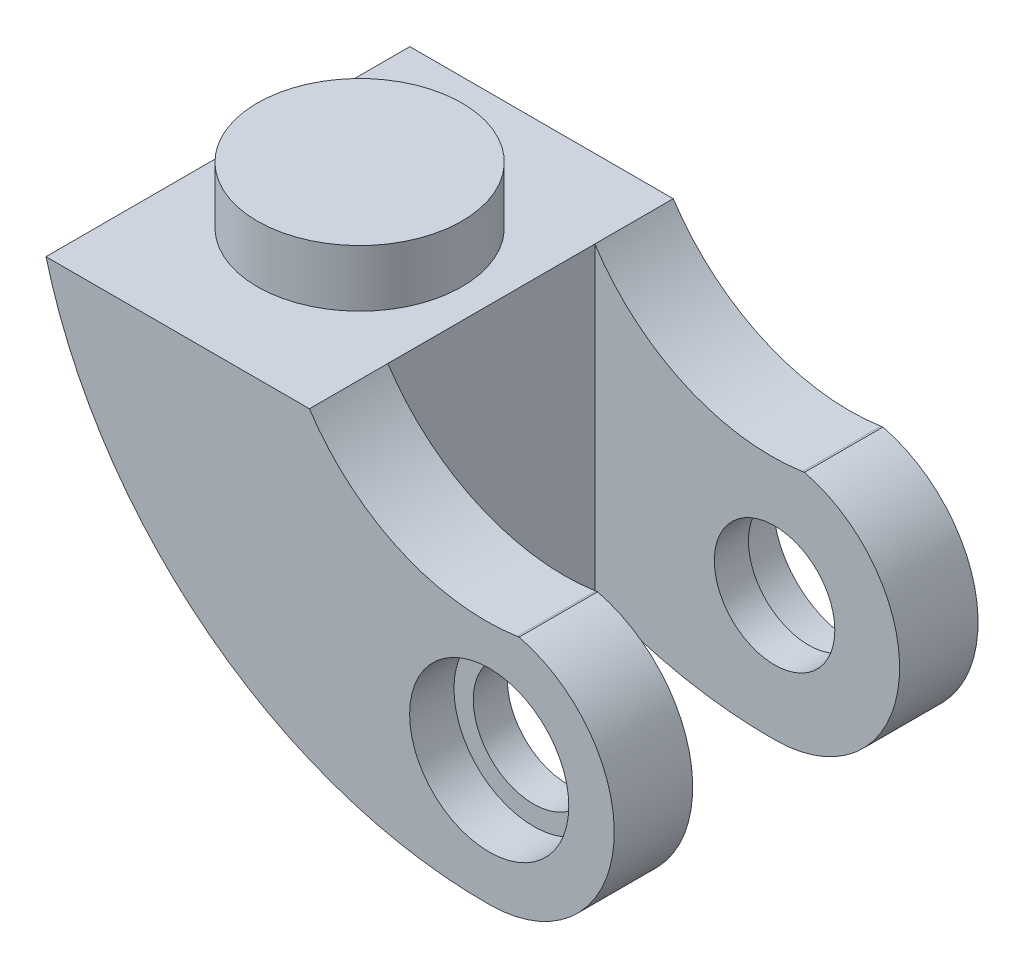
ISO-10303-21;
HEADER;
FILE_DESCRIPTION(('STEP AP214'),'2;1');
FILE_NAME('part.step','',(''),(''),'','','');
FILE_SCHEMA(('AUTOMOTIVE_DESIGN { 1 0 10303 214 1 1 1 1 }'));
ENDSEC;
DATA;
#1=APPLICATION_CONTEXT('core data for automotive mechanical design processes');
#2=APPLICATION_PROTOCOL_DEFINITION('international standard','automotive_design',2000,#1);
#3=PRODUCT_CONTEXT('',#1,'mechanical');
#4=PRODUCT('Part','Part','',(#3));
#5=PRODUCT_RELATED_PRODUCT_CATEGORY('part','',(#4));
#6=PRODUCT_DEFINITION_FORMATION('','',#4);
#7=PRODUCT_DEFINITION_CONTEXT('part definition',#1,'design');
#8=PRODUCT_DEFINITION('design','',#6,#7);
#9=PRODUCT_DEFINITION_SHAPE('','',#8);
#10=(LENGTH_UNIT() NAMED_UNIT(*) SI_UNIT(.MILLI.,.METRE.));
#11=(NAMED_UNIT(*) PLANE_ANGLE_UNIT() SI_UNIT($,.RADIAN.));
#12=(NAMED_UNIT(*) SI_UNIT($,.STERADIAN.) SOLID_ANGLE_UNIT());
#13=UNCERTAINTY_MEASURE_WITH_UNIT(LENGTH_MEASURE(1.E-05),#10,'distance_accuracy_value','');
#14=(GEOMETRIC_REPRESENTATION_CONTEXT(3) GLOBAL_UNCERTAINTY_ASSIGNED_CONTEXT((#13)) GLOBAL_UNIT_ASSIGNED_CONTEXT((#10,
#11,#12)) REPRESENTATION_CONTEXT('',''));
#15=CARTESIAN_POINT('',(0.,0.,0.));
#16=DIRECTION('',(0.,0.,1.));
#17=DIRECTION('',(1.,0.,0.));
#18=AXIS2_PLACEMENT_3D('',#15,#16,#17);
#19=CARTESIAN_POINT('',(0.,0.,16.));
#20=DIRECTION('',(0.,0.,-1.));
#21=DIRECTION('',(-1.,0.,0.));
#22=AXIS2_PLACEMENT_3D('',#19,#20,#21);
#23=CYLINDRICAL_SURFACE('',#22,3.5);
#24=CARTESIAN_POINT('',(0.,0.,0.));
#25=DIRECTION('',(0.,0.,1.));
#26=DIRECTION('',(1.,0.,0.));
#27=AXIS2_PLACEMENT_3D('',#24,#25,#26);
#28=CIRCLE('',#27,3.5);
#29=CARTESIAN_POINT('',(3.5,0.,0.));
#30=VERTEX_POINT('',#29);
#31=EDGE_CURVE('E240',#30,#30,#28,.T.);
#32=ORIENTED_EDGE('',*,*,#31,.F.);
#33=EDGE_LOOP('',(#32));
#34=FACE_BOUND('',#33,.T.);
#35=CARTESIAN_POINT('',(0.,0.,1.95));
#36=DIRECTION('',(0.,0.,1.));
#37=DIRECTION('',(1.,0.,0.));
#38=AXIS2_PLACEMENT_3D('',#35,#36,#37);
#39=CIRCLE('',#38,3.5);
#40=CARTESIAN_POINT('',(3.5,0.,1.95));
#41=VERTEX_POINT('',#40);
#42=EDGE_CURVE('E252',#41,#41,#39,.T.);
#43=ORIENTED_EDGE('',*,*,#42,.T.);
#44=EDGE_LOOP('',(#43));
#45=FACE_BOUND('',#44,.T.);
#46=ADVANCED_FACE('F51',(#34,#45),#23,.F.);
#47=CARTESIAN_POINT('',(0.,0.,16.));
#48=DIRECTION('',(0.,0.,1.));
#49=DIRECTION('',(1.,0.,0.));
#50=AXIS2_PLACEMENT_3D('',#47,#48,#49);
#51=CIRCLE('',#50,3.5);
#52=CARTESIAN_POINT('',(3.5,0.,16.));
#53=VERTEX_POINT('',#52);
#54=EDGE_CURVE('E147',#53,#53,#51,.T.);
#55=ORIENTED_EDGE('',*,*,#54,.T.);
#56=EDGE_LOOP('',(#55));
#57=FACE_BOUND('',#56,.T.);
#58=CARTESIAN_POINT('',(0.,0.,14.05));
#59=DIRECTION('',(0.,0.,-1.));
#60=DIRECTION('',(-1.,0.,0.));
#61=AXIS2_PLACEMENT_3D('',#58,#59,#60);
#62=CIRCLE('',#61,3.5);
#63=CARTESIAN_POINT('',(-3.5,0.,14.05));
#64=VERTEX_POINT('',#63);
#65=EDGE_CURVE('E218',#64,#64,#62,.T.);
#66=ORIENTED_EDGE('',*,*,#65,.T.);
#67=EDGE_LOOP('',(#66));
#68=FACE_BOUND('',#67,.T.);
#69=ADVANCED_FACE('F248',(#57,#68),#23,.F.);
#70=CARTESIAN_POINT('',(0.,0.,16.));
#71=DIRECTION('',(0.,0.,-1.));
#72=DIRECTION('',(-1.,0.,0.));
#73=AXIS2_PLACEMENT_3D('',#70,#71,#72);
#74=CYLINDRICAL_SURFACE('',#73,5.5);
#75=DIRECTION('',(0.,0.,-1.));
#76=VECTOR('',#75,1.);
#77=CARTESIAN_POINT('',(1.31438446593075,5.34063605535145,16.));
#78=LINE('',#77,#76);
#79=CARTESIAN_POINT('',(1.31438446593075,5.34063605535145,3.45));
#80=VERTEX_POINT('',#79);
#81=CARTESIAN_POINT('',(1.31438446593075,5.34063605535145,0.));
#82=VERTEX_POINT('',#81);
#83=EDGE_CURVE('E126',#80,#82,#78,.T.);
#84=ORIENTED_EDGE('',*,*,#83,.F.);
#85=CARTESIAN_POINT('',(0.,0.,3.45));
#86=DIRECTION('',(0.,0.,-1.));
#87=DIRECTION('',(-1.,0.,0.));
#88=AXIS2_PLACEMENT_3D('',#85,#86,#87);
#89=CIRCLE('',#88,5.5);
#90=CARTESIAN_POINT('',(0.0547182158346811,-5.49972780388774,3.45));
#91=VERTEX_POINT('',#90);
#92=EDGE_CURVE('E233',#80,#91,#89,.T.);
#93=ORIENTED_EDGE('',*,*,#92,.T.);
#94=DIRECTION('',(0.,0.,-1.));
#95=VECTOR('',#94,1.);
#96=CARTESIAN_POINT('',(0.0547182158346811,-5.49972780388774,16.));
#97=LINE('',#96,#95);
#98=CARTESIAN_POINT('',(0.0547182158346811,-5.49972780388774,0.));
#99=VERTEX_POINT('',#98);
#100=EDGE_CURVE('E59',#91,#99,#97,.T.);
#101=ORIENTED_EDGE('',*,*,#100,.T.);
#102=CARTESIAN_POINT('',(0.,0.,0.));
#103=DIRECTION('',(0.,0.,1.));
#104=DIRECTION('',(1.,0.,0.));
#105=AXIS2_PLACEMENT_3D('',#102,#103,#104);
#106=CIRCLE('',#105,5.5);
#107=EDGE_CURVE('E146',#99,#82,#106,.T.);
#108=ORIENTED_EDGE('',*,*,#107,.T.);
#109=EDGE_LOOP('',(#84,#93,#101,#108));
#110=FACE_BOUND('',#109,.T.);
#111=ADVANCED_FACE('F176',(#110),#74,.T.);
#112=CARTESIAN_POINT('',(1.23021267462178,5.33052803706647,16.));
#113=DIRECTION('',(-0.119231308054851,0.992866504208662,0.));
#114=DIRECTION('',(-0.992866504208662,-0.119231308054851,0.));
#115=AXIS2_PLACEMENT_3D('',#112,#113,#114);
#116=PLANE('',#115);
#117=DIRECTION('',(-0.992866504208662,-0.119231308054851,0.));
#118=VECTOR('',#117,1.);
#119=CARTESIAN_POINT('',(1.23021267462178,5.33052803706647,3.45));
#120=LINE('',#119,#118);
#121=CARTESIAN_POINT('',(1.23021267462178,5.33052803706647,3.45));
#122=VERTEX_POINT('',#121);
#123=EDGE_CURVE('E172',#80,#122,#120,.T.);
#124=ORIENTED_EDGE('',*,*,#123,.F.);
#125=ORIENTED_EDGE('',*,*,#83,.T.);
#126=DIRECTION('',(0.992866504208662,0.119231308054851,0.));
#127=VECTOR('',#126,1.);
#128=CARTESIAN_POINT('',(1.23021267462178,5.33052803706647,0.));
#129=LINE('',#128,#127);
#130=CARTESIAN_POINT('',(1.23021267462178,5.33052803706647,0.));
#131=VERTEX_POINT('',#130);
#132=EDGE_CURVE('E150',#131,#82,#129,.T.);
#133=ORIENTED_EDGE('',*,*,#132,.F.);
#134=DIRECTION('',(0.,0.,-1.));
#135=VECTOR('',#134,1.);
#136=CARTESIAN_POINT('',(1.23021267462178,5.33052803706647,16.));
#137=LINE('',#136,#135);
#138=EDGE_CURVE('E127',#122,#131,#137,.T.);
#139=ORIENTED_EDGE('',*,*,#138,.F.);
#140=EDGE_LOOP('',(#124,#125,#133,#139));
#141=FACE_BOUND('',#140,.T.);
#142=ADVANCED_FACE('F168',(#141),#116,.T.);
#143=CARTESIAN_POINT('',(-0.14425711447326,14.4992823920677,16.));
#144=DIRECTION('',(0.,0.,-1.));
#145=DIRECTION('',(-1.,0.,0.));
#146=AXIS2_PLACEMENT_3D('',#143,#144,#145);
#147=CYLINDRICAL_SURFACE('',#146,9.27120400074815);
#148=CARTESIAN_POINT('',(-0.14425711447326,14.4992823920677,3.45));
#149=DIRECTION('',(0.,0.,-1.));
#150=DIRECTION('',(-1.,0.,0.));
#151=AXIS2_PLACEMENT_3D('',#148,#149,#150);
#152=CIRCLE('',#151,9.27120400074815);
#153=CARTESIAN_POINT('',(-7.90572953036058,9.42830915600058,3.45));
#154=VERTEX_POINT('',#153);
#155=EDGE_CURVE('E188',#122,#154,#152,.T.);
#156=ORIENTED_EDGE('',*,*,#155,.F.);
#157=ORIENTED_EDGE('',*,*,#138,.T.);
#158=CARTESIAN_POINT('',(-0.14425711447326,14.4992823920677,0.));
#159=DIRECTION('',(0.,0.,1.));
#160=DIRECTION('',(1.,0.,0.));
#161=AXIS2_PLACEMENT_3D('',#158,#159,#160);
#162=CIRCLE('',#161,9.27120400074815);
#163=CARTESIAN_POINT('',(-7.90572953036058,9.42830915600058,0.));
#164=VERTEX_POINT('',#163);
#165=EDGE_CURVE('E153',#164,#131,#162,.T.);
#166=ORIENTED_EDGE('',*,*,#165,.F.);
#167=DIRECTION('',(0.,0.,-1.));
#168=VECTOR('',#167,1.);
#169=CARTESIAN_POINT('',(-7.90572953036058,9.42830915600058,16.));
#170=LINE('',#169,#168);
#171=EDGE_CURVE('E161',#154,#164,#170,.T.);
#172=ORIENTED_EDGE('',*,*,#171,.F.);
#173=EDGE_LOOP('',(#156,#157,#166,#172));
#174=FACE_BOUND('',#173,.T.);
#175=ADVANCED_FACE('F185',(#174),#147,.F.);
#176=CARTESIAN_POINT('',(-0.14425711447326,14.4992823920677,16.));
#177=DIRECTION('',(0.,0.,1.));
#178=DIRECTION('',(1.,0.,0.));
#179=AXIS2_PLACEMENT_3D('',#176,#177,#178);
#180=PLANE('',#179);
#181=CARTESIAN_POINT('',(-0.14425711447326,14.4992823920677,16.));
#182=DIRECTION('',(0.,0.,1.));
#183=DIRECTION('',(1.,0.,0.));
#184=AXIS2_PLACEMENT_3D('',#181,#182,#183);
#185=CIRCLE('',#184,20.);
#186=CARTESIAN_POINT('',(-19.4907097722369,9.42830915600058,16.));
#187=VERTEX_POINT('',#186);
#188=CARTESIAN_POINT('',(0.0547182158346811,-5.49972780388774,16.));
#189=VERTEX_POINT('',#188);
#190=EDGE_CURVE('E159',#187,#189,#185,.T.);
#191=ORIENTED_EDGE('',*,*,#190,.T.);
#192=CARTESIAN_POINT('',(0.,0.,16.));
#193=DIRECTION('',(0.,0.,1.));
#194=DIRECTION('',(1.,0.,0.));
#195=AXIS2_PLACEMENT_3D('',#192,#193,#194);
#196=CIRCLE('',#195,5.5);
#197=CARTESIAN_POINT('',(1.31438446593075,5.34063605535145,16.));
#198=VERTEX_POINT('',#197);
#199=EDGE_CURVE('E105',#189,#198,#196,.T.);
#200=ORIENTED_EDGE('',*,*,#199,.T.);
#201=DIRECTION('',(0.992866504208662,0.119231308054851,0.));
#202=VECTOR('',#201,1.);
#203=CARTESIAN_POINT('',(1.23021267462178,5.33052803706647,16.));
#204=LINE('',#203,#202);
#205=CARTESIAN_POINT('',(1.23021267462178,5.33052803706647,16.));
#206=VERTEX_POINT('',#205);
#207=EDGE_CURVE('E119',#206,#198,#204,.T.);
#208=ORIENTED_EDGE('',*,*,#207,.F.);
#209=CARTESIAN_POINT('',(-0.14425711447326,14.4992823920677,16.));
#210=DIRECTION('',(0.,0.,1.));
#211=DIRECTION('',(1.,0.,0.));
#212=AXIS2_PLACEMENT_3D('',#209,#210,#211);
#213=CIRCLE('',#212,9.27120400074815);
#214=CARTESIAN_POINT('',(-7.90572953036058,9.42830915600058,16.));
#215=VERTEX_POINT('',#214);
#216=EDGE_CURVE('E134',#215,#206,#213,.T.);
#217=ORIENTED_EDGE('',*,*,#216,.F.);
#218=DIRECTION('',(1.,0.,0.));
#219=VECTOR('',#218,1.);
#220=CARTESIAN_POINT('',(-19.4907097722369,9.42830915600058,16.));
#221=LINE('',#220,#219);
#222=EDGE_CURVE('E139',#187,#215,#221,.T.);
#223=ORIENTED_EDGE('',*,*,#222,.F.);
#224=EDGE_LOOP('',(#191,#200,#208,#217,#223));
#225=FACE_BOUND('',#224,.T.);
#226=ORIENTED_EDGE('',*,*,#54,.F.);
#227=EDGE_LOOP('',(#226));
#228=FACE_BOUND('',#227,.T.);
#229=ADVANCED_FACE('F131',(#225,#228),#180,.T.);
#230=CARTESIAN_POINT('',(-0.14425711447326,14.4992823920677,0.));
#231=DIRECTION('',(0.,0.,1.));
#232=DIRECTION('',(1.,0.,0.));
#233=AXIS2_PLACEMENT_3D('',#230,#231,#232);
#234=PLANE('',#233);
#235=CARTESIAN_POINT('',(-0.14425711447326,14.4992823920677,0.));
#236=DIRECTION('',(0.,0.,1.));
#237=DIRECTION('',(1.,0.,0.));
#238=AXIS2_PLACEMENT_3D('',#235,#236,#237);
#239=CIRCLE('',#238,20.);
#240=CARTESIAN_POINT('',(-19.4907097722369,9.42830915600058,0.));
#241=VERTEX_POINT('',#240);
#242=EDGE_CURVE('E144',#241,#99,#239,.T.);
#243=ORIENTED_EDGE('',*,*,#242,.F.);
#244=DIRECTION('',(1.,0.,0.));
#245=VECTOR('',#244,1.);
#246=CARTESIAN_POINT('',(-19.4907097722369,9.42830915600058,0.));
#247=LINE('',#246,#245);
#248=EDGE_CURVE('E156',#241,#164,#247,.T.);
#249=ORIENTED_EDGE('',*,*,#248,.T.);
#250=ORIENTED_EDGE('',*,*,#165,.T.);
#251=ORIENTED_EDGE('',*,*,#132,.T.);
#252=ORIENTED_EDGE('',*,*,#107,.F.);
#253=EDGE_LOOP('',(#243,#249,#250,#251,#252));
#254=FACE_BOUND('',#253,.T.);
#255=ORIENTED_EDGE('',*,*,#31,.T.);
#256=EDGE_LOOP('',(#255));
#257=FACE_BOUND('',#256,.T.);
#258=ADVANCED_FACE('F179',(#254,#257),#234,.F.);
#259=CARTESIAN_POINT('',(-0.14425711447326,14.4992823920677,16.));
#260=DIRECTION('',(0.,0.,-1.));
#261=DIRECTION('',(-1.,0.,0.));
#262=AXIS2_PLACEMENT_3D('',#259,#260,#261);
#263=CYLINDRICAL_SURFACE('',#262,20.);
#264=ORIENTED_EDGE('',*,*,#100,.F.);
#265=CARTESIAN_POINT('',(-0.14425711447326,14.4992823920677,3.45));
#266=DIRECTION('',(0.,0.,-1.));
#267=DIRECTION('',(-1.,0.,0.));
#268=AXIS2_PLACEMENT_3D('',#265,#266,#267);
#269=CIRCLE('',#268,20.);
#270=CARTESIAN_POINT('',(-7.90572953036058,-3.93328514307024,3.45));
#271=VERTEX_POINT('',#270);
#272=EDGE_CURVE('E235',#91,#271,#269,.T.);
#273=ORIENTED_EDGE('',*,*,#272,.T.);
#274=DIRECTION('',(0.,0.,-1.));
#275=VECTOR('',#274,1.);
#276=CARTESIAN_POINT('',(-7.90572953036058,-3.93328514307024,16.));
#277=LINE('',#276,#275);
#278=CARTESIAN_POINT('',(-7.90572953036058,-3.93328514307024,12.55));
#279=VERTEX_POINT('',#278);
#280=EDGE_CURVE('E238',#271,#279,#277,.F.);
#281=ORIENTED_EDGE('',*,*,#280,.T.);
#282=CARTESIAN_POINT('',(-0.14425711447326,14.4992823920677,12.55));
#283=DIRECTION('',(0.,0.,1.));
#284=DIRECTION('',(1.,0.,0.));
#285=AXIS2_PLACEMENT_3D('',#282,#283,#284);
#286=CIRCLE('',#285,20.);
#287=CARTESIAN_POINT('',(0.0547182158346811,-5.49972780388774,12.55));
#288=VERTEX_POINT('',#287);
#289=EDGE_CURVE('E213',#279,#288,#286,.T.);
#290=ORIENTED_EDGE('',*,*,#289,.T.);
#291=EDGE_CURVE('E12',#189,#288,#97,.T.);
#292=ORIENTED_EDGE('',*,*,#291,.F.);
#293=ORIENTED_EDGE('',*,*,#190,.F.);
#294=DIRECTION('',(0.,0.,-1.));
#295=VECTOR('',#294,1.);
#296=CARTESIAN_POINT('',(-19.4907097722369,9.42830915600058,16.));
#297=LINE('',#296,#295);
#298=EDGE_CURVE('E75',#187,#241,#297,.T.);
#299=ORIENTED_EDGE('',*,*,#298,.T.);
#300=ORIENTED_EDGE('',*,*,#242,.T.);
#301=EDGE_LOOP('',(#264,#273,#281,#290,#292,#293,#299,#300));
#302=FACE_BOUND('',#301,.T.);
#303=ADVANCED_FACE('F53',(#302),#263,.T.);
#304=ORIENTED_EDGE('',*,*,#291,.T.);
#305=CARTESIAN_POINT('',(0.,0.,12.55));
#306=DIRECTION('',(0.,0.,1.));
#307=DIRECTION('',(1.,0.,0.));
#308=AXIS2_PLACEMENT_3D('',#305,#306,#307);
#309=CIRCLE('',#308,5.5);
#310=CARTESIAN_POINT('',(1.31438446593075,5.34063605535145,12.55));
#311=VERTEX_POINT('',#310);
#312=EDGE_CURVE('E226',#288,#311,#309,.T.);
#313=ORIENTED_EDGE('',*,*,#312,.T.);
#314=EDGE_CURVE('E162',#198,#311,#78,.T.);
#315=ORIENTED_EDGE('',*,*,#314,.F.);
#316=ORIENTED_EDGE('',*,*,#199,.F.);
#317=EDGE_LOOP('',(#304,#313,#315,#316));
#318=FACE_BOUND('',#317,.T.);
#319=ADVANCED_FACE('F225',(#318),#74,.T.);
#320=DIRECTION('',(0.992866504208662,0.119231308054851,0.));
#321=VECTOR('',#320,1.);
#322=CARTESIAN_POINT('',(1.23021267462178,5.33052803706647,12.55));
#323=LINE('',#322,#321);
#324=CARTESIAN_POINT('',(1.23021267462178,5.33052803706647,12.55));
#325=VERTEX_POINT('',#324);
#326=EDGE_CURVE('E122',#325,#311,#323,.T.);
#327=ORIENTED_EDGE('',*,*,#326,.F.);
#328=EDGE_CURVE('E115',#206,#325,#137,.T.);
#329=ORIENTED_EDGE('',*,*,#328,.F.);
#330=ORIENTED_EDGE('',*,*,#207,.T.);
#331=ORIENTED_EDGE('',*,*,#314,.T.);
#332=EDGE_LOOP('',(#327,#329,#330,#331));
#333=FACE_BOUND('',#332,.T.);
#334=ADVANCED_FACE('F117',(#333),#116,.T.);
#335=CARTESIAN_POINT('',(-0.14425711447326,14.4992823920677,12.55));
#336=DIRECTION('',(0.,0.,1.));
#337=DIRECTION('',(1.,0.,0.));
#338=AXIS2_PLACEMENT_3D('',#335,#336,#337);
#339=CIRCLE('',#338,9.27120400074815);
#340=CARTESIAN_POINT('',(-7.90572953036058,9.42830915600058,12.55));
#341=VERTEX_POINT('',#340);
#342=EDGE_CURVE('E211',#341,#325,#339,.T.);
#343=ORIENTED_EDGE('',*,*,#342,.F.);
#344=EDGE_CURVE('E138',#215,#341,#170,.T.);
#345=ORIENTED_EDGE('',*,*,#344,.F.);
#346=ORIENTED_EDGE('',*,*,#216,.T.);
#347=ORIENTED_EDGE('',*,*,#328,.T.);
#348=EDGE_LOOP('',(#343,#345,#346,#347));
#349=FACE_BOUND('',#348,.T.);
#350=ADVANCED_FACE('F136',(#349),#147,.F.);
#351=CARTESIAN_POINT('',(-19.4907097722369,9.42830915600058,16.));
#352=DIRECTION('',(0.,1.,0.));
#353=DIRECTION('',(0.,0.,1.));
#354=AXIS2_PLACEMENT_3D('',#351,#352,#353);
#355=PLANE('',#354);
#356=CARTESIAN_POINT('',(-13.6982196512988,9.42830915600058,8.));
#357=DIRECTION('',(0.,1.,0.));
#358=DIRECTION('',(0.,0.,1.));
#359=AXIS2_PLACEMENT_3D('',#356,#357,#358);
#360=CIRCLE('',#359,4.5);
#361=CARTESIAN_POINT('',(-13.6982196512988,9.42830915600058,12.5));
#362=VERTEX_POINT('',#361);
#363=EDGE_CURVE('E439',#362,#362,#360,.T.);
#364=ORIENTED_EDGE('',*,*,#363,.F.);
#365=EDGE_LOOP('',(#364));
#366=FACE_BOUND('',#365,.T.);
#367=ORIENTED_EDGE('',*,*,#248,.F.);
#368=ORIENTED_EDGE('',*,*,#298,.F.);
#369=ORIENTED_EDGE('',*,*,#222,.T.);
#370=ORIENTED_EDGE('',*,*,#344,.T.);
#371=DIRECTION('',(0.,0.,1.));
#372=VECTOR('',#371,1.);
#373=CARTESIAN_POINT('',(-7.90572953036058,9.42830915600058,12.55));
#374=LINE('',#373,#372);
#375=EDGE_CURVE('E215',#154,#341,#374,.T.);
#376=ORIENTED_EDGE('',*,*,#375,.F.);
#377=ORIENTED_EDGE('',*,*,#171,.T.);
#378=EDGE_LOOP('',(#367,#368,#369,#370,#376,#377));
#379=FACE_BOUND('',#378,.T.);
#380=ADVANCED_FACE('F221',(#366,#379),#355,.T.);
#381=CARTESIAN_POINT('',(-7.90572953036058,-12.5716908439994,12.55));
#382=DIRECTION('',(-1.,0.,0.));
#383=DIRECTION('',(0.,0.,1.));
#384=AXIS2_PLACEMENT_3D('',#381,#382,#383);
#385=PLANE('',#384);
#386=DIRECTION('',(0.,1.,0.));
#387=VECTOR('',#386,1.);
#388=CARTESIAN_POINT('',(-7.90572953036058,-12.5716908439994,3.45));
#389=LINE('',#388,#387);
#390=EDGE_CURVE('E66',#271,#154,#389,.T.);
#391=ORIENTED_EDGE('',*,*,#390,.T.);
#392=ORIENTED_EDGE('',*,*,#375,.T.);
#393=DIRECTION('',(0.,1.,0.));
#394=VECTOR('',#393,1.);
#395=CARTESIAN_POINT('',(-7.90572953036058,-12.5716908439994,12.55));
#396=LINE('',#395,#394);
#397=EDGE_CURVE('E208',#279,#341,#396,.T.);
#398=ORIENTED_EDGE('',*,*,#397,.F.);
#399=ORIENTED_EDGE('',*,*,#280,.F.);
#400=EDGE_LOOP('',(#391,#392,#398,#399));
#401=FACE_BOUND('',#400,.T.);
#402=ADVANCED_FACE('F217',(#401),#385,.F.);
#403=CARTESIAN_POINT('',(-7.90572953036058,-12.5716908439994,3.45));
#404=DIRECTION('',(0.,0.,-1.));
#405=DIRECTION('',(-1.,0.,0.));
#406=AXIS2_PLACEMENT_3D('',#403,#404,#405);
#407=PLANE('',#406);
#408=ORIENTED_EDGE('',*,*,#92,.F.);
#409=ORIENTED_EDGE('',*,*,#123,.T.);
#410=ORIENTED_EDGE('',*,*,#155,.T.);
#411=ORIENTED_EDGE('',*,*,#390,.F.);
#412=ORIENTED_EDGE('',*,*,#272,.F.);
#413=EDGE_LOOP('',(#408,#409,#410,#411,#412));
#414=FACE_BOUND('',#413,.T.);
#415=CARTESIAN_POINT('',(0.,0.,3.45));
#416=DIRECTION('',(0.,0.,1.));
#417=DIRECTION('',(1.,0.,0.));
#418=AXIS2_PLACEMENT_3D('',#415,#416,#417);
#419=CIRCLE('',#418,2.65);
#420=CARTESIAN_POINT('',(2.65,0.,3.45));
#421=VERTEX_POINT('',#420);
#422=EDGE_CURVE('E261',#421,#421,#419,.T.);
#423=ORIENTED_EDGE('',*,*,#422,.F.);
#424=EDGE_LOOP('',(#423));
#425=FACE_BOUND('',#424,.T.);
#426=ADVANCED_FACE('F284',(#414,#425),#407,.F.);
#427=CARTESIAN_POINT('',(-7.90572953036058,-12.5716908439994,12.55));
#428=DIRECTION('',(0.,0.,1.));
#429=DIRECTION('',(1.,0.,0.));
#430=AXIS2_PLACEMENT_3D('',#427,#428,#429);
#431=PLANE('',#430);
#432=ORIENTED_EDGE('',*,*,#397,.T.);
#433=ORIENTED_EDGE('',*,*,#342,.T.);
#434=ORIENTED_EDGE('',*,*,#326,.T.);
#435=ORIENTED_EDGE('',*,*,#312,.F.);
#436=ORIENTED_EDGE('',*,*,#289,.F.);
#437=EDGE_LOOP('',(#432,#433,#434,#435,#436));
#438=FACE_BOUND('',#437,.T.);
#439=CARTESIAN_POINT('',(0.,0.,12.55));
#440=DIRECTION('',(0.,0.,-1.));
#441=DIRECTION('',(-1.,0.,0.));
#442=AXIS2_PLACEMENT_3D('',#439,#440,#441);
#443=CIRCLE('',#442,2.65);
#444=CARTESIAN_POINT('',(-2.65,0.,12.55));
#445=VERTEX_POINT('',#444);
#446=EDGE_CURVE('E254',#445,#445,#443,.T.);
#447=ORIENTED_EDGE('',*,*,#446,.F.);
#448=EDGE_LOOP('',(#447));
#449=FACE_BOUND('',#448,.T.);
#450=ADVANCED_FACE('F209',(#438,#449),#431,.F.);
#451=CARTESIAN_POINT('',(0.,0.,14.05));
#452=DIRECTION('',(0.,0.,-1.));
#453=DIRECTION('',(-1.,0.,0.));
#454=AXIS2_PLACEMENT_3D('',#451,#452,#453);
#455=PLANE('',#454);
#456=CARTESIAN_POINT('',(0.,0.,14.05));
#457=DIRECTION('',(0.,0.,-1.));
#458=DIRECTION('',(-1.,0.,0.));
#459=AXIS2_PLACEMENT_3D('',#456,#457,#458);
#460=CIRCLE('',#459,2.65);
#461=CARTESIAN_POINT('',(-2.65,0.,14.05));
#462=VERTEX_POINT('',#461);
#463=EDGE_CURVE('E258',#462,#462,#460,.T.);
#464=ORIENTED_EDGE('',*,*,#463,.T.);
#465=EDGE_LOOP('',(#464));
#466=FACE_BOUND('',#465,.T.);
#467=ORIENTED_EDGE('',*,*,#65,.F.);
#468=EDGE_LOOP('',(#467));
#469=FACE_BOUND('',#468,.T.);
#470=ADVANCED_FACE('F272',(#466,#469),#455,.F.);
#471=CARTESIAN_POINT('',(0.,0.,14.05));
#472=DIRECTION('',(0.,0.,-1.));
#473=DIRECTION('',(-1.,0.,0.));
#474=AXIS2_PLACEMENT_3D('',#471,#472,#473);
#475=CYLINDRICAL_SURFACE('',#474,2.65);
#476=ORIENTED_EDGE('',*,*,#463,.F.);
#477=EDGE_LOOP('',(#476));
#478=FACE_BOUND('',#477,.T.);
#479=ORIENTED_EDGE('',*,*,#446,.T.);
#480=EDGE_LOOP('',(#479));
#481=FACE_BOUND('',#480,.T.);
#482=ADVANCED_FACE('F274',(#478,#481),#475,.F.);
#483=CARTESIAN_POINT('',(0.,0.,1.95));
#484=DIRECTION('',(0.,0.,1.));
#485=DIRECTION('',(1.,0.,0.));
#486=AXIS2_PLACEMENT_3D('',#483,#484,#485);
#487=PLANE('',#486);
#488=CARTESIAN_POINT('',(0.,0.,1.95));
#489=DIRECTION('',(0.,0.,1.));
#490=DIRECTION('',(1.,0.,0.));
#491=AXIS2_PLACEMENT_3D('',#488,#489,#490);
#492=CIRCLE('',#491,2.65);
#493=CARTESIAN_POINT('',(2.65,0.,1.95));
#494=VERTEX_POINT('',#493);
#495=EDGE_CURVE('E255',#494,#494,#492,.T.);
#496=ORIENTED_EDGE('',*,*,#495,.T.);
#497=EDGE_LOOP('',(#496));
#498=FACE_BOUND('',#497,.T.);
#499=ORIENTED_EDGE('',*,*,#42,.F.);
#500=EDGE_LOOP('',(#499));
#501=FACE_BOUND('',#500,.T.);
#502=ADVANCED_FACE('F281',(#498,#501),#487,.F.);
#503=CARTESIAN_POINT('',(0.,0.,1.95));
#504=DIRECTION('',(0.,0.,1.));
#505=DIRECTION('',(1.,0.,0.));
#506=AXIS2_PLACEMENT_3D('',#503,#504,#505);
#507=CYLINDRICAL_SURFACE('',#506,2.65);
#508=ORIENTED_EDGE('',*,*,#495,.F.);
#509=EDGE_LOOP('',(#508));
#510=FACE_BOUND('',#509,.T.);
#511=ORIENTED_EDGE('',*,*,#422,.T.);
#512=EDGE_LOOP('',(#511));
#513=FACE_BOUND('',#512,.T.);
#514=ADVANCED_FACE('F398',(#510,#513),#507,.F.);
#515=CARTESIAN_POINT('',(-13.6982196512988,11.9283091560006,8.));
#516=DIRECTION('',(0.,-1.,0.));
#517=DIRECTION('',(0.,0.,-1.));
#518=AXIS2_PLACEMENT_3D('',#515,#516,#517);
#519=CYLINDRICAL_SURFACE('',#518,4.5);
#520=CARTESIAN_POINT('',(-13.6982196512988,11.9283091560006,8.));
#521=DIRECTION('',(0.,1.,0.));
#522=DIRECTION('',(0.,0.,1.));
#523=AXIS2_PLACEMENT_3D('',#520,#521,#522);
#524=CIRCLE('',#523,4.5);
#525=CARTESIAN_POINT('',(-13.6982196512988,11.9283091560006,12.5));
#526=VERTEX_POINT('',#525);
#527=EDGE_CURVE('E438',#526,#526,#524,.T.);
#528=ORIENTED_EDGE('',*,*,#527,.F.);
#529=EDGE_LOOP('',(#528));
#530=FACE_BOUND('',#529,.T.);
#531=ORIENTED_EDGE('',*,*,#363,.T.);
#532=EDGE_LOOP('',(#531));
#533=FACE_BOUND('',#532,.T.);
#534=ADVANCED_FACE('F407',(#530,#533),#519,.T.);
#535=CARTESIAN_POINT('',(-13.6982196512988,11.9283091560006,8.));
#536=DIRECTION('',(0.,1.,0.));
#537=DIRECTION('',(0.,0.,1.));
#538=AXIS2_PLACEMENT_3D('',#535,#536,#537);
#539=PLANE('',#538);
#540=ORIENTED_EDGE('',*,*,#527,.T.);
#541=EDGE_LOOP('',(#540));
#542=FACE_BOUND('',#541,.T.);
#543=ADVANCED_FACE('F422',(#542),#539,.T.);
#544=CLOSED_SHELL('',(#46,#69,#111,#142,#175,#229,#258,#303,#319,#334,#350,#380,#402,#426,#450,
#470,#482,#502,#514,#534,#543));
#545=MANIFOLD_SOLID_BREP('B2',#544);
#546=ADVANCED_BREP_SHAPE_REPRESENTATION('',(#18,#545),#14);
#547=SHAPE_DEFINITION_REPRESENTATION(#9,#546);
ENDSEC;
END-ISO-10303-21;
